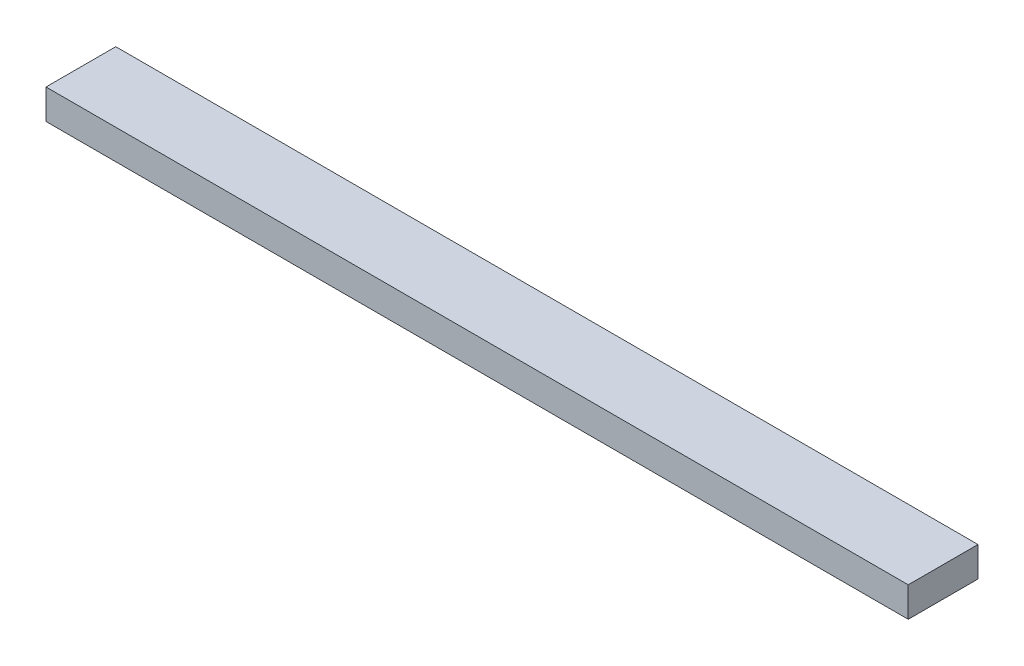
ISO-10303-21;
HEADER;
FILE_DESCRIPTION(('STEP AP214'),'2;1');
FILE_NAME('part.step','',(''),(''),'','','');
FILE_SCHEMA(('AUTOMOTIVE_DESIGN { 1 0 10303 214 1 1 1 1 }'));
ENDSEC;
DATA;
#1=APPLICATION_CONTEXT('core data for automotive mechanical design processes');
#2=APPLICATION_PROTOCOL_DEFINITION('international standard','automotive_design',2000,#1);
#3=PRODUCT_CONTEXT('',#1,'mechanical');
#4=PRODUCT('Part','Part','',(#3));
#5=PRODUCT_RELATED_PRODUCT_CATEGORY('part','',(#4));
#6=PRODUCT_DEFINITION_FORMATION('','',#4);
#7=PRODUCT_DEFINITION_CONTEXT('part definition',#1,'design');
#8=PRODUCT_DEFINITION('design','',#6,#7);
#9=PRODUCT_DEFINITION_SHAPE('','',#8);
#10=(LENGTH_UNIT() NAMED_UNIT(*) SI_UNIT(.MILLI.,.METRE.));
#11=(NAMED_UNIT(*) PLANE_ANGLE_UNIT() SI_UNIT($,.RADIAN.));
#12=(NAMED_UNIT(*) SI_UNIT($,.STERADIAN.) SOLID_ANGLE_UNIT());
#13=UNCERTAINTY_MEASURE_WITH_UNIT(LENGTH_MEASURE(1.E-05),#10,'distance_accuracy_value','');
#14=(GEOMETRIC_REPRESENTATION_CONTEXT(3) GLOBAL_UNCERTAINTY_ASSIGNED_CONTEXT((#13)) GLOBAL_UNIT_ASSIGNED_CONTEXT((#10,
#11,#12)) REPRESENTATION_CONTEXT('',''));
#15=CARTESIAN_POINT('',(0.,0.,0.));
#16=DIRECTION('',(0.,0.,1.));
#17=DIRECTION('',(1.,0.,0.));
#18=AXIS2_PLACEMENT_3D('',#15,#16,#17);
#19=CARTESIAN_POINT('',(0.,38.1,0.));
#20=DIRECTION('',(0.,1.,0.));
#21=DIRECTION('',(0.,0.,1.));
#22=AXIS2_PLACEMENT_3D('',#19,#20,#21);
#23=PLANE('',#22);
#24=DIRECTION('',(0.,0.,-1.));
#25=VECTOR('',#24,1.);
#26=CARTESIAN_POINT('',(549.275,38.1,44.45));
#27=LINE('',#26,#25);
#28=CARTESIAN_POINT('',(549.275,38.1,-44.45));
#29=VERTEX_POINT('',#28);
#30=CARTESIAN_POINT('',(549.275,38.1,44.45));
#31=VERTEX_POINT('',#30);
#32=EDGE_CURVE('E67',#29,#31,#27,.F.);
#33=ORIENTED_EDGE('',*,*,#32,.F.);
#34=DIRECTION('',(-1.,0.,0.));
#35=VECTOR('',#34,1.);
#36=CARTESIAN_POINT('',(549.275,38.1,-44.45));
#37=LINE('',#36,#35);
#38=CARTESIAN_POINT('',(-549.275,38.1,-44.45));
#39=VERTEX_POINT('',#38);
#40=EDGE_CURVE('E19',#39,#29,#37,.F.);
#41=ORIENTED_EDGE('',*,*,#40,.F.);
#42=DIRECTION('',(0.,0.,1.));
#43=VECTOR('',#42,1.);
#44=CARTESIAN_POINT('',(-549.275,38.1,-44.45));
#45=LINE('',#44,#43);
#46=CARTESIAN_POINT('',(-549.275,38.1,44.45));
#47=VERTEX_POINT('',#46);
#48=EDGE_CURVE('E57',#47,#39,#45,.F.);
#49=ORIENTED_EDGE('',*,*,#48,.F.);
#50=DIRECTION('',(1.,0.,0.));
#51=VECTOR('',#50,1.);
#52=CARTESIAN_POINT('',(-549.275,38.1,44.45));
#53=LINE('',#52,#51);
#54=EDGE_CURVE('E52',#31,#47,#53,.F.);
#55=ORIENTED_EDGE('',*,*,#54,.F.);
#56=EDGE_LOOP('',(#33,#41,#49,#55));
#57=FACE_BOUND('',#56,.T.);
#58=ADVANCED_FACE('F16',(#57),#23,.T.);
#59=CARTESIAN_POINT('',(549.275,0.,-44.45));
#60=DIRECTION('',(0.,0.,-1.));
#61=DIRECTION('',(-1.,0.,0.));
#62=AXIS2_PLACEMENT_3D('',#59,#60,#61);
#63=PLANE('',#62);
#64=DIRECTION('',(0.,1.,0.));
#65=VECTOR('',#64,1.);
#66=CARTESIAN_POINT('',(549.275,0.,-44.45));
#67=LINE('',#66,#65);
#68=CARTESIAN_POINT('',(549.275,0.,-44.45));
#69=VERTEX_POINT('',#68);
#70=EDGE_CURVE('E78',#69,#29,#67,.T.);
#71=ORIENTED_EDGE('',*,*,#70,.F.);
#72=DIRECTION('',(1.,0.,0.));
#73=VECTOR('',#72,1.);
#74=CARTESIAN_POINT('',(0.,0.,-44.45));
#75=LINE('',#74,#73);
#76=CARTESIAN_POINT('',(-549.275,0.,-44.45));
#77=VERTEX_POINT('',#76);
#78=EDGE_CURVE('E73',#69,#77,#75,.F.);
#79=ORIENTED_EDGE('',*,*,#78,.T.);
#80=DIRECTION('',(0.,1.,0.));
#81=VECTOR('',#80,1.);
#82=CARTESIAN_POINT('',(-549.275,0.,-44.45));
#83=LINE('',#82,#81);
#84=EDGE_CURVE('E62',#39,#77,#83,.F.);
#85=ORIENTED_EDGE('',*,*,#84,.F.);
#86=ORIENTED_EDGE('',*,*,#40,.T.);
#87=EDGE_LOOP('',(#71,#79,#85,#86));
#88=FACE_BOUND('',#87,.T.);
#89=ADVANCED_FACE('F72',(#88),#63,.T.);
#90=CARTESIAN_POINT('',(-549.275,0.,-44.45));
#91=DIRECTION('',(-1.,0.,0.));
#92=DIRECTION('',(0.,0.,1.));
#93=AXIS2_PLACEMENT_3D('',#90,#91,#92);
#94=PLANE('',#93);
#95=ORIENTED_EDGE('',*,*,#84,.T.);
#96=DIRECTION('',(0.,0.,1.));
#97=VECTOR('',#96,1.);
#98=CARTESIAN_POINT('',(-549.275,0.,0.));
#99=LINE('',#98,#97);
#100=CARTESIAN_POINT('',(-549.275,0.,44.45));
#101=VERTEX_POINT('',#100);
#102=EDGE_CURVE('E83',#77,#101,#99,.T.);
#103=ORIENTED_EDGE('',*,*,#102,.T.);
#104=DIRECTION('',(0.,1.,0.));
#105=VECTOR('',#104,1.);
#106=CARTESIAN_POINT('',(-549.275,0.,44.45));
#107=LINE('',#106,#105);
#108=EDGE_CURVE('E64',#47,#101,#107,.F.);
#109=ORIENTED_EDGE('',*,*,#108,.F.);
#110=ORIENTED_EDGE('',*,*,#48,.T.);
#111=EDGE_LOOP('',(#95,#103,#109,#110));
#112=FACE_BOUND('',#111,.T.);
#113=ADVANCED_FACE('F59',(#112),#94,.T.);
#114=CARTESIAN_POINT('',(-549.275,0.,44.45));
#115=DIRECTION('',(0.,0.,1.));
#116=DIRECTION('',(1.,0.,0.));
#117=AXIS2_PLACEMENT_3D('',#114,#115,#116);
#118=PLANE('',#117);
#119=ORIENTED_EDGE('',*,*,#108,.T.);
#120=DIRECTION('',(1.,0.,0.));
#121=VECTOR('',#120,1.);
#122=CARTESIAN_POINT('',(0.,0.,44.45));
#123=LINE('',#122,#121);
#124=CARTESIAN_POINT('',(549.275,0.,44.45));
#125=VERTEX_POINT('',#124);
#126=EDGE_CURVE('E25',#101,#125,#123,.T.);
#127=ORIENTED_EDGE('',*,*,#126,.T.);
#128=DIRECTION('',(0.,1.,0.));
#129=VECTOR('',#128,1.);
#130=CARTESIAN_POINT('',(549.275,0.,44.45));
#131=LINE('',#130,#129);
#132=EDGE_CURVE('E33',#31,#125,#131,.F.);
#133=ORIENTED_EDGE('',*,*,#132,.F.);
#134=ORIENTED_EDGE('',*,*,#54,.T.);
#135=EDGE_LOOP('',(#119,#127,#133,#134));
#136=FACE_BOUND('',#135,.T.);
#137=ADVANCED_FACE('F87',(#136),#118,.T.);
#138=CARTESIAN_POINT('',(549.275,0.,44.45));
#139=DIRECTION('',(1.,0.,0.));
#140=DIRECTION('',(0.,0.,-1.));
#141=AXIS2_PLACEMENT_3D('',#138,#139,#140);
#142=PLANE('',#141);
#143=ORIENTED_EDGE('',*,*,#132,.T.);
#144=DIRECTION('',(0.,0.,1.));
#145=VECTOR('',#144,1.);
#146=CARTESIAN_POINT('',(549.275,0.,0.));
#147=LINE('',#146,#145);
#148=EDGE_CURVE('E11',#125,#69,#147,.F.);
#149=ORIENTED_EDGE('',*,*,#148,.T.);
#150=ORIENTED_EDGE('',*,*,#70,.T.);
#151=ORIENTED_EDGE('',*,*,#32,.T.);
#152=EDGE_LOOP('',(#143,#149,#150,#151));
#153=FACE_BOUND('',#152,.T.);
#154=ADVANCED_FACE('F90',(#153),#142,.T.);
#155=CARTESIAN_POINT('',(0.,0.,0.));
#156=DIRECTION('',(0.,1.,0.));
#157=DIRECTION('',(0.,0.,1.));
#158=AXIS2_PLACEMENT_3D('',#155,#156,#157);
#159=PLANE('',#158);
#160=ORIENTED_EDGE('',*,*,#126,.F.);
#161=ORIENTED_EDGE('',*,*,#102,.F.);
#162=ORIENTED_EDGE('',*,*,#78,.F.);
#163=ORIENTED_EDGE('',*,*,#148,.F.);
#164=EDGE_LOOP('',(#160,#161,#162,#163));
#165=FACE_BOUND('',#164,.T.);
#166=ADVANCED_FACE('F89',(#165),#159,.F.);
#167=CLOSED_SHELL('',(#58,#89,#113,#137,#154,#166));
#168=MANIFOLD_SOLID_BREP('B1',#167);
#169=ADVANCED_BREP_SHAPE_REPRESENTATION('',(#18,#168),#14);
#170=SHAPE_DEFINITION_REPRESENTATION(#9,#169);
ENDSEC;
END-ISO-10303-21;
